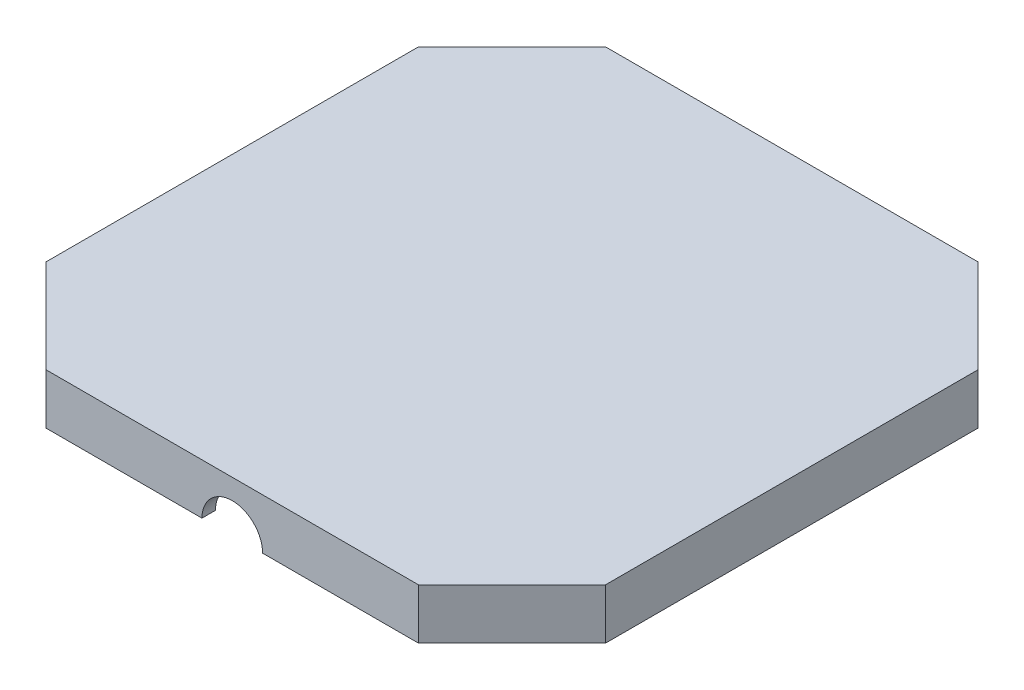
ISO-10303-21;
HEADER;
FILE_DESCRIPTION(('STEP AP214'),'2;1');
FILE_NAME('part.step','',(''),(''),'','','');
FILE_SCHEMA(('AUTOMOTIVE_DESIGN { 1 0 10303 214 1 1 1 1 }'));
ENDSEC;
DATA;
#1=APPLICATION_CONTEXT('core data for automotive mechanical design processes');
#2=APPLICATION_PROTOCOL_DEFINITION('international standard','automotive_design',2000,#1);
#3=PRODUCT_CONTEXT('',#1,'mechanical');
#4=PRODUCT('Part','Part','',(#3));
#5=PRODUCT_RELATED_PRODUCT_CATEGORY('part','',(#4));
#6=PRODUCT_DEFINITION_FORMATION('','',#4);
#7=PRODUCT_DEFINITION_CONTEXT('part definition',#1,'design');
#8=PRODUCT_DEFINITION('design','',#6,#7);
#9=PRODUCT_DEFINITION_SHAPE('','',#8);
#10=(LENGTH_UNIT() NAMED_UNIT(*) SI_UNIT(.MILLI.,.METRE.));
#11=(NAMED_UNIT(*) PLANE_ANGLE_UNIT() SI_UNIT($,.RADIAN.));
#12=(NAMED_UNIT(*) SI_UNIT($,.STERADIAN.) SOLID_ANGLE_UNIT());
#13=UNCERTAINTY_MEASURE_WITH_UNIT(LENGTH_MEASURE(1.E-05),#10,'distance_accuracy_value','');
#14=(GEOMETRIC_REPRESENTATION_CONTEXT(3) GLOBAL_UNCERTAINTY_ASSIGNED_CONTEXT((#13)) GLOBAL_UNIT_ASSIGNED_CONTEXT((#10,
#11,#12)) REPRESENTATION_CONTEXT('',''));
#15=CARTESIAN_POINT('',(0.,0.,0.));
#16=DIRECTION('',(0.,0.,1.));
#17=DIRECTION('',(1.,0.,0.));
#18=AXIS2_PLACEMENT_3D('',#15,#16,#17);
#19=CARTESIAN_POINT('',(-16.390525726858,13.,-48.8918002812121));
#20=DIRECTION('',(0.,0.,1.));
#21=DIRECTION('',(1.,0.,0.));
#22=AXIS2_PLACEMENT_3D('',#19,#20,#21);
#23=PLANE('',#22);
#24=DIRECTION('',(-1.,0.,0.));
#25=VECTOR('',#24,1.);
#26=CARTESIAN_POINT('',(-16.390525726858,7.5,-48.8918002812121));
#27=LINE('',#26,#25);
#28=CARTESIAN_POINT('',(38.0610471483957,7.5,-48.8918002812122));
#29=VERTEX_POINT('',#28);
#30=CARTESIAN_POINT('',(-15.5620986021118,7.5,-48.8918002812121));
#31=VERTEX_POINT('',#30);
#32=EDGE_CURVE('E11',#29,#31,#27,.T.);
#33=ORIENTED_EDGE('',*,*,#32,.F.);
#34=DIRECTION('',(0.,-1.,0.));
#35=VECTOR('',#34,1.);
#36=CARTESIAN_POINT('',(38.0610471483957,13.,-48.8918002812122));
#37=LINE('',#36,#35);
#38=CARTESIAN_POINT('',(38.0610471483957,13.,-48.8918002812122));
#39=VERTEX_POINT('',#38);
#40=EDGE_CURVE('E277',#39,#29,#37,.T.);
#41=ORIENTED_EDGE('',*,*,#40,.F.);
#42=DIRECTION('',(-1.,0.,0.));
#43=VECTOR('',#42,1.);
#44=CARTESIAN_POINT('',(-16.390525726858,13.,-48.8918002812121));
#45=LINE('',#44,#43);
#46=CARTESIAN_POINT('',(-15.5620986021118,13.,-48.8918002812121));
#47=VERTEX_POINT('',#46);
#48=EDGE_CURVE('E372',#39,#47,#45,.T.);
#49=ORIENTED_EDGE('',*,*,#48,.T.);
#50=DIRECTION('',(0.,-1.,0.));
#51=VECTOR('',#50,1.);
#52=CARTESIAN_POINT('',(-15.5620986021118,13.,-48.8918002812121));
#53=LINE('',#52,#51);
#54=EDGE_CURVE('E374',#47,#31,#53,.T.);
#55=ORIENTED_EDGE('',*,*,#54,.T.);
#56=EDGE_LOOP('',(#33,#41,#49,#55));
#57=FACE_BOUND('',#56,.T.);
#58=ADVANCED_FACE('F40',(#57),#23,.T.);
#59=CARTESIAN_POINT('',(-28.8356050757413,13.,-35.6182938075828));
#60=DIRECTION('',(0.707106781186544,0.,0.707106781186551));
#61=DIRECTION('',(0.707106781186551,0.,-0.707106781186544));
#62=AXIS2_PLACEMENT_3D('',#59,#60,#61);
#63=PLANE('',#62);
#64=DIRECTION('',(-0.707106781186551,0.,0.707106781186544));
#65=VECTOR('',#64,1.);
#66=CARTESIAN_POINT('',(-28.8356050757413,7.5,-35.6182938075828));
#67=LINE('',#66,#65);
#68=CARTESIAN_POINT('',(-28.2498186381144,7.5,-36.2040802452097));
#69=VERTEX_POINT('',#68);
#70=EDGE_CURVE('E407',#31,#69,#67,.T.);
#71=ORIENTED_EDGE('',*,*,#70,.F.);
#72=ORIENTED_EDGE('',*,*,#54,.F.);
#73=DIRECTION('',(-0.707106781186551,0.,0.707106781186544));
#74=VECTOR('',#73,1.);
#75=CARTESIAN_POINT('',(-28.8356050757413,13.,-35.6182938075828));
#76=LINE('',#75,#74);
#77=CARTESIAN_POINT('',(-28.2498186381144,13.,-36.2040802452097));
#78=VERTEX_POINT('',#77);
#79=EDGE_CURVE('E390',#47,#78,#76,.T.);
#80=ORIENTED_EDGE('',*,*,#79,.T.);
#81=DIRECTION('',(0.,-1.,0.));
#82=VECTOR('',#81,1.);
#83=CARTESIAN_POINT('',(-28.2498186381144,13.,-36.2040802452097));
#84=LINE('',#83,#82);
#85=EDGE_CURVE('E397',#78,#69,#84,.T.);
#86=ORIENTED_EDGE('',*,*,#85,.T.);
#87=EDGE_LOOP('',(#71,#72,#80,#86));
#88=FACE_BOUND('',#87,.T.);
#89=ADVANCED_FACE('F458',(#88),#63,.T.);
#90=CARTESIAN_POINT('',(13.96,7.5,0.));
#91=DIRECTION('',(0.,1.,0.));
#92=DIRECTION('',(0.,0.,1.));
#93=AXIS2_PLACEMENT_3D('',#90,#91,#92);
#94=PLANE('',#93);
#95=DIRECTION('',(0.,0.,1.));
#96=VECTOR('',#95,1.);
#97=CARTESIAN_POINT('',(-28.2498186381144,7.5,46.1674926300441));
#98=LINE('',#97,#96);
#99=CARTESIAN_POINT('',(-28.2498186381144,7.5,17.4190655052979));
#100=VERTEX_POINT('',#99);
#101=EDGE_CURVE('E49',#69,#100,#98,.T.);
#102=ORIENTED_EDGE('',*,*,#101,.T.);
#103=DIRECTION('',(0.707106781186546,0.,0.707106781186549));
#104=VECTOR('',#103,1.);
#105=CARTESIAN_POINT('',(-14.976312164485,7.5,30.6925719789274));
#106=LINE('',#105,#104);
#107=CARTESIAN_POINT('',(-15.5620986021119,7.5,30.1067855413005));
#108=VERTEX_POINT('',#107);
#109=EDGE_CURVE('E328',#100,#108,#106,.T.);
#110=ORIENTED_EDGE('',*,*,#109,.T.);
#111=DIRECTION('',(1.,0.,0.));
#112=VECTOR('',#111,1.);
#113=CARTESIAN_POINT('',(66.809474273142,7.5,30.1067855413005));
#114=LINE('',#113,#112);
#115=CARTESIAN_POINT('',(6.74947427314191,7.5,30.1067855413005));
#116=VERTEX_POINT('',#115);
#117=EDGE_CURVE('E326',#108,#116,#114,.T.);
#118=ORIENTED_EDGE('',*,*,#117,.T.);
#119=DIRECTION('',(0.,0.,1.));
#120=VECTOR('',#119,1.);
#121=CARTESIAN_POINT('',(6.74947427314191,7.5,22.1067855413005));
#122=LINE('',#121,#120);
#123=CARTESIAN_POINT('',(6.74947427314191,7.5,32.1067855413005));
#124=VERTEX_POINT('',#123);
#125=EDGE_CURVE('E308',#116,#124,#122,.T.);
#126=ORIENTED_EDGE('',*,*,#125,.T.);
#127=DIRECTION('',(1.,0.,0.));
#128=VECTOR('',#127,1.);
#129=CARTESIAN_POINT('',(66.809474273142,7.5,32.1067855413005));
#130=LINE('',#129,#128);
#131=CARTESIAN_POINT('',(-16.3905257268581,7.5,32.1067855413005));
#132=VERTEX_POINT('',#131);
#133=EDGE_CURVE('E329',#132,#124,#130,.T.);
#134=ORIENTED_EDGE('',*,*,#133,.F.);
#135=DIRECTION('',(0.707106781186546,0.,0.707106781186549));
#136=VECTOR('',#135,1.);
#137=CARTESIAN_POINT('',(-16.3905257268581,7.5,32.1067855413005));
#138=LINE('',#137,#136);
#139=CARTESIAN_POINT('',(-30.2498186381144,7.5,18.2474926300441));
#140=VERTEX_POINT('',#139);
#141=EDGE_CURVE('E331',#140,#132,#138,.T.);
#142=ORIENTED_EDGE('',*,*,#141,.F.);
#143=DIRECTION('',(0.,0.,1.));
#144=VECTOR('',#143,1.);
#145=CARTESIAN_POINT('',(-30.2498186381144,7.5,46.1674926300441));
#146=LINE('',#145,#144);
#147=CARTESIAN_POINT('',(-30.2498186381144,7.5,-37.0325073699559));
#148=VERTEX_POINT('',#147);
#149=EDGE_CURVE('E366',#148,#140,#146,.T.);
#150=ORIENTED_EDGE('',*,*,#149,.F.);
#151=DIRECTION('',(-0.707106781186551,0.,0.707106781186544));
#152=VECTOR('',#151,1.);
#153=CARTESIAN_POINT('',(-30.2498186381144,7.5,-37.0325073699559));
#154=LINE('',#153,#152);
#155=CARTESIAN_POINT('',(-16.390525726858,7.5,-50.8918002812121));
#156=VERTEX_POINT('',#155);
#157=EDGE_CURVE('E409',#156,#148,#154,.T.);
#158=ORIENTED_EDGE('',*,*,#157,.F.);
#159=DIRECTION('',(-1.,0.,0.));
#160=VECTOR('',#159,1.);
#161=CARTESIAN_POINT('',(-16.390525726858,7.5,-50.8918002812121));
#162=LINE('',#161,#160);
#163=CARTESIAN_POINT('',(38.8894742731419,7.5,-50.8918002812122));
#164=VERTEX_POINT('',#163);
#165=EDGE_CURVE('E364',#164,#156,#162,.T.);
#166=ORIENTED_EDGE('',*,*,#165,.F.);
#167=DIRECTION('',(-0.707106781186545,0.,-0.70710678118655));
#168=VECTOR('',#167,1.);
#169=CARTESIAN_POINT('',(52.7487671843983,7.5,-37.0325073699558));
#170=LINE('',#169,#168);
#171=CARTESIAN_POINT('',(52.7487671843983,7.5,-37.0325073699558));
#172=VERTEX_POINT('',#171);
#173=EDGE_CURVE('E293',#172,#164,#170,.T.);
#174=ORIENTED_EDGE('',*,*,#173,.F.);
#175=DIRECTION('',(0.,0.,-1.));
#176=VECTOR('',#175,1.);
#177=CARTESIAN_POINT('',(52.7487671843983,7.5,-37.0325073699558));
#178=LINE('',#177,#176);
#179=CARTESIAN_POINT('',(52.7487671843983,7.5,18.2474926300442));
#180=VERTEX_POINT('',#179);
#181=EDGE_CURVE('E300',#180,#172,#178,.T.);
#182=ORIENTED_EDGE('',*,*,#181,.F.);
#183=DIRECTION('',(0.707106781186549,0.,-0.707106781186546));
#184=VECTOR('',#183,1.);
#185=CARTESIAN_POINT('',(38.889474273142,7.5,32.1067855413005));
#186=LINE('',#185,#184);
#187=CARTESIAN_POINT('',(38.889474273142,7.5,32.1067855413005));
#188=VERTEX_POINT('',#187);
#189=EDGE_CURVE('E259',#188,#180,#186,.T.);
#190=ORIENTED_EDGE('',*,*,#189,.F.);
#191=DIRECTION('',(1.,0.,0.));
#192=VECTOR('',#191,1.);
#193=CARTESIAN_POINT('',(52.849474273142,7.5,32.1067855413005));
#194=LINE('',#193,#192);
#195=CARTESIAN_POINT('',(15.7494742731419,7.5,32.1067855413005));
#196=VERTEX_POINT('',#195);
#197=EDGE_CURVE('E306',#196,#188,#194,.T.);
#198=ORIENTED_EDGE('',*,*,#197,.F.);
#199=DIRECTION('',(0.,0.,1.));
#200=VECTOR('',#199,1.);
#201=CARTESIAN_POINT('',(15.7494742731419,7.5,22.1067855413005));
#202=LINE('',#201,#200);
#203=CARTESIAN_POINT('',(15.7494742731419,7.5,30.1067855413005));
#204=VERTEX_POINT('',#203);
#205=EDGE_CURVE('E312',#196,#204,#202,.F.);
#206=ORIENTED_EDGE('',*,*,#205,.T.);
#207=DIRECTION('',(1.,0.,0.));
#208=VECTOR('',#207,1.);
#209=CARTESIAN_POINT('',(52.849474273142,7.5,30.1067855413005));
#210=LINE('',#209,#208);
#211=CARTESIAN_POINT('',(38.0610471483958,7.5,30.1067855413005));
#212=VERTEX_POINT('',#211);
#213=EDGE_CURVE('E296',#204,#212,#210,.T.);
#214=ORIENTED_EDGE('',*,*,#213,.T.);
#215=DIRECTION('',(0.707106781186549,0.,-0.707106781186546));
#216=VECTOR('',#215,1.);
#217=CARTESIAN_POINT('',(37.4752607107689,7.5,30.6925719789274));
#218=LINE('',#217,#216);
#219=CARTESIAN_POINT('',(50.7487671843983,7.5,17.419065505298));
#220=VERTEX_POINT('',#219);
#221=EDGE_CURVE('E260',#212,#220,#218,.T.);
#222=ORIENTED_EDGE('',*,*,#221,.T.);
#223=DIRECTION('',(0.,0.,-1.));
#224=VECTOR('',#223,1.);
#225=CARTESIAN_POINT('',(50.7487671843983,7.5,-37.0325073699558));
#226=LINE('',#225,#224);
#227=CARTESIAN_POINT('',(50.7487671843983,7.5,-36.2040802452096));
#228=VERTEX_POINT('',#227);
#229=EDGE_CURVE('E297',#220,#228,#226,.T.);
#230=ORIENTED_EDGE('',*,*,#229,.T.);
#231=DIRECTION('',(-0.707106781186545,0.,-0.70710678118655));
#232=VECTOR('',#231,1.);
#233=CARTESIAN_POINT('',(51.3345536220252,7.5,-35.6182938075827));
#234=LINE('',#233,#232);
#235=EDGE_CURVE('E294',#228,#29,#234,.T.);
#236=ORIENTED_EDGE('',*,*,#235,.T.);
#237=ORIENTED_EDGE('',*,*,#32,.T.);
#238=ORIENTED_EDGE('',*,*,#70,.T.);
#239=EDGE_LOOP('',(#102,#110,#118,#126,#134,#142,#150,#158,#166,#174,#182,#190,#198,#206,#214,
#222,#230,#236,#237,#238));
#240=FACE_BOUND('',#239,.T.);
#241=ADVANCED_FACE('F464',(#240),#94,.F.);
#242=CARTESIAN_POINT('',(-30.2498186381144,15.,-37.0325073699559));
#243=DIRECTION('',(0.707106781186544,0.,0.707106781186551));
#244=DIRECTION('',(0.707106781186551,0.,-0.707106781186544));
#245=AXIS2_PLACEMENT_3D('',#242,#243,#244);
#246=PLANE('',#245);
#247=DIRECTION('',(0.,-1.,0.));
#248=VECTOR('',#247,1.);
#249=CARTESIAN_POINT('',(-16.390525726858,15.,-50.8918002812121));
#250=LINE('',#249,#248);
#251=CARTESIAN_POINT('',(-16.390525726858,15.,-50.8918002812121));
#252=VERTEX_POINT('',#251);
#253=EDGE_CURVE('E370',#252,#156,#250,.T.);
#254=ORIENTED_EDGE('',*,*,#253,.T.);
#255=ORIENTED_EDGE('',*,*,#157,.T.);
#256=DIRECTION('',(0.,-1.,0.));
#257=VECTOR('',#256,1.);
#258=CARTESIAN_POINT('',(-30.2498186381144,15.,-37.0325073699559));
#259=LINE('',#258,#257);
#260=CARTESIAN_POINT('',(-30.2498186381144,15.,-37.0325073699559));
#261=VERTEX_POINT('',#260);
#262=EDGE_CURVE('E367',#261,#148,#259,.T.);
#263=ORIENTED_EDGE('',*,*,#262,.F.);
#264=DIRECTION('',(-0.707106781186551,0.,0.707106781186544));
#265=VECTOR('',#264,1.);
#266=CARTESIAN_POINT('',(-30.2498186381144,15.,-37.0325073699559));
#267=LINE('',#266,#265);
#268=EDGE_CURVE('E400',#252,#261,#267,.T.);
#269=ORIENTED_EDGE('',*,*,#268,.F.);
#270=EDGE_LOOP('',(#254,#255,#263,#269));
#271=FACE_BOUND('',#270,.T.);
#272=ADVANCED_FACE('F474',(#271),#246,.F.);
#273=CARTESIAN_POINT('',(-16.390525726858,15.,-50.8918002812121));
#274=DIRECTION('',(0.,0.,1.));
#275=DIRECTION('',(1.,0.,0.));
#276=AXIS2_PLACEMENT_3D('',#273,#274,#275);
#277=PLANE('',#276);
#278=DIRECTION('',(-1.,0.,0.));
#279=VECTOR('',#278,1.);
#280=CARTESIAN_POINT('',(-16.390525726858,15.,-50.8918002812121));
#281=LINE('',#280,#279);
#282=CARTESIAN_POINT('',(38.8894742731419,15.,-50.8918002812122));
#283=VERTEX_POINT('',#282);
#284=EDGE_CURVE('E368',#283,#252,#281,.T.);
#285=ORIENTED_EDGE('',*,*,#284,.F.);
#286=DIRECTION('',(0.,-1.,0.));
#287=VECTOR('',#286,1.);
#288=CARTESIAN_POINT('',(38.8894742731419,15.,-50.8918002812122));
#289=LINE('',#288,#287);
#290=EDGE_CURVE('E287',#283,#164,#289,.T.);
#291=ORIENTED_EDGE('',*,*,#290,.T.);
#292=ORIENTED_EDGE('',*,*,#165,.T.);
#293=ORIENTED_EDGE('',*,*,#253,.F.);
#294=EDGE_LOOP('',(#285,#291,#292,#293));
#295=FACE_BOUND('',#294,.T.);
#296=ADVANCED_FACE('F471',(#295),#277,.F.);
#297=CARTESIAN_POINT('',(13.96,13.,0.));
#298=DIRECTION('',(0.,1.,0.));
#299=DIRECTION('',(0.,0.,1.));
#300=AXIS2_PLACEMENT_3D('',#297,#298,#299);
#301=PLANE('',#300);
#302=DIRECTION('',(0.707106781186549,0.,-0.707106781186546));
#303=VECTOR('',#302,1.);
#304=CARTESIAN_POINT('',(37.4752607107689,13.,30.6925719789274));
#305=LINE('',#304,#303);
#306=CARTESIAN_POINT('',(38.0610471483958,13.,30.1067855413005));
#307=VERTEX_POINT('',#306);
#308=CARTESIAN_POINT('',(50.7487671843983,13.,17.419065505298));
#309=VERTEX_POINT('',#308);
#310=EDGE_CURVE('E240',#307,#309,#305,.T.);
#311=ORIENTED_EDGE('',*,*,#310,.F.);
#312=DIRECTION('',(1.,0.,0.));
#313=VECTOR('',#312,1.);
#314=CARTESIAN_POINT('',(66.809474273142,13.,30.1067855413005));
#315=LINE('',#314,#313);
#316=CARTESIAN_POINT('',(-15.5620986021119,13.,30.1067855413005));
#317=VERTEX_POINT('',#316);
#318=EDGE_CURVE('E337',#317,#307,#315,.T.);
#319=ORIENTED_EDGE('',*,*,#318,.F.);
#320=DIRECTION('',(0.707106781186546,0.,0.707106781186549));
#321=VECTOR('',#320,1.);
#322=CARTESIAN_POINT('',(-14.976312164485,13.,30.6925719789274));
#323=LINE('',#322,#321);
#324=CARTESIAN_POINT('',(-28.2498186381144,13.,17.4190655052979));
#325=VERTEX_POINT('',#324);
#326=EDGE_CURVE('E340',#325,#317,#323,.T.);
#327=ORIENTED_EDGE('',*,*,#326,.F.);
#328=DIRECTION('',(0.,0.,1.));
#329=VECTOR('',#328,1.);
#330=CARTESIAN_POINT('',(-28.2498186381144,13.,46.1674926300441));
#331=LINE('',#330,#329);
#332=EDGE_CURVE('E375',#78,#325,#331,.T.);
#333=ORIENTED_EDGE('',*,*,#332,.F.);
#334=ORIENTED_EDGE('',*,*,#79,.F.);
#335=ORIENTED_EDGE('',*,*,#48,.F.);
#336=DIRECTION('',(-0.707106781186545,0.,-0.70710678118655));
#337=VECTOR('',#336,1.);
#338=CARTESIAN_POINT('',(51.3345536220252,13.,-35.6182938075827));
#339=LINE('',#338,#337);
#340=CARTESIAN_POINT('',(50.7487671843983,13.,-36.2040802452096));
#341=VERTEX_POINT('',#340);
#342=EDGE_CURVE('E274',#341,#39,#339,.T.);
#343=ORIENTED_EDGE('',*,*,#342,.F.);
#344=DIRECTION('',(0.,0.,-1.));
#345=VECTOR('',#344,1.);
#346=CARTESIAN_POINT('',(50.7487671843983,13.,-37.0325073699558));
#347=LINE('',#346,#345);
#348=EDGE_CURVE('E271',#309,#341,#347,.T.);
#349=ORIENTED_EDGE('',*,*,#348,.F.);
#350=EDGE_LOOP('',(#311,#319,#327,#333,#334,#335,#343,#349));
#351=FACE_BOUND('',#350,.T.);
#352=DIRECTION('',(0.,0.,-1.));
#353=VECTOR('',#352,1.);
#354=CARTESIAN_POINT('',(-16.2498186381144,13.,40.3685027568208));
#355=LINE('',#354,#353);
#356=CARTESIAN_POINT('',(-16.2498186381144,13.,12.4485027568208));
#357=VERTEX_POINT('',#356);
#358=CARTESIAN_POINT('',(-16.2498186381144,13.,-31.2335174967325));
#359=VERTEX_POINT('',#358);
#360=EDGE_CURVE('E44',#357,#359,#355,.T.);
#361=ORIENTED_EDGE('',*,*,#360,.F.);
#362=DIRECTION('',(-0.707106781186546,0.,-0.707106781186549));
#363=VECTOR('',#362,1.);
#364=CARTESIAN_POINT('',(-10.5915358536348,13.,18.1067855413005));
#365=LINE('',#364,#363);
#366=CARTESIAN_POINT('',(-10.5915358536348,13.,18.1067855413005));
#367=VERTEX_POINT('',#366);
#368=EDGE_CURVE('E324',#367,#357,#365,.T.);
#369=ORIENTED_EDGE('',*,*,#368,.F.);
#370=DIRECTION('',(-1.,0.,0.));
#371=VECTOR('',#370,1.);
#372=CARTESIAN_POINT('',(61.0104843999187,13.,18.1067855413005));
#373=LINE('',#372,#371);
#374=CARTESIAN_POINT('',(33.0904843999187,13.,18.1067855413005));
#375=VERTEX_POINT('',#374);
#376=EDGE_CURVE('E320',#375,#367,#373,.T.);
#377=ORIENTED_EDGE('',*,*,#376,.F.);
#378=DIRECTION('',(-0.707106781186549,0.,0.707106781186546));
#379=VECTOR('',#378,1.);
#380=CARTESIAN_POINT('',(38.7487671843983,13.,12.4485027568209));
#381=LINE('',#380,#379);
#382=CARTESIAN_POINT('',(38.7487671843983,13.,12.4485027568209));
#383=VERTEX_POINT('',#382);
#384=EDGE_CURVE('E236',#383,#375,#381,.T.);
#385=ORIENTED_EDGE('',*,*,#384,.F.);
#386=DIRECTION('',(0.,0.,1.));
#387=VECTOR('',#386,1.);
#388=CARTESIAN_POINT('',(38.7487671843983,13.,-31.2335174967325));
#389=LINE('',#388,#387);
#390=CARTESIAN_POINT('',(38.7487671843983,13.,-31.2335174967325));
#391=VERTEX_POINT('',#390);
#392=EDGE_CURVE('E227',#391,#383,#389,.T.);
#393=ORIENTED_EDGE('',*,*,#392,.F.);
#394=DIRECTION('',(0.707106781186546,0.,0.707106781186549));
#395=VECTOR('',#394,1.);
#396=CARTESIAN_POINT('',(33.0904843999186,13.,-36.8918002812122));
#397=LINE('',#396,#395);
#398=CARTESIAN_POINT('',(33.0904843999186,13.,-36.8918002812122));
#399=VERTEX_POINT('',#398);
#400=EDGE_CURVE('E263',#399,#391,#397,.T.);
#401=ORIENTED_EDGE('',*,*,#400,.F.);
#402=DIRECTION('',(1.,0.,0.));
#403=VECTOR('',#402,1.);
#404=CARTESIAN_POINT('',(-10.5915358536347,13.,-36.8918002812121));
#405=LINE('',#404,#403);
#406=CARTESIAN_POINT('',(-10.5915358536347,13.,-36.8918002812121));
#407=VERTEX_POINT('',#406);
#408=EDGE_CURVE('E380',#407,#399,#405,.T.);
#409=ORIENTED_EDGE('',*,*,#408,.F.);
#410=DIRECTION('',(0.707106781186551,0.,-0.707106781186544));
#411=VECTOR('',#410,1.);
#412=CARTESIAN_POINT('',(-16.2498186381144,13.,-31.2335174967325));
#413=LINE('',#412,#411);
#414=EDGE_CURVE('E383',#359,#407,#413,.T.);
#415=ORIENTED_EDGE('',*,*,#414,.F.);
#416=EDGE_LOOP('',(#361,#369,#377,#385,#393,#401,#409,#415));
#417=FACE_BOUND('',#416,.T.);
#418=ADVANCED_FACE('F432',(#351,#417),#301,.F.);
#419=CARTESIAN_POINT('',(-10.5915358536347,14.,-36.8918002812121));
#420=DIRECTION('',(0.,0.,-1.));
#421=DIRECTION('',(-1.,0.,0.));
#422=AXIS2_PLACEMENT_3D('',#419,#420,#421);
#423=PLANE('',#422);
#424=ORIENTED_EDGE('',*,*,#408,.T.);
#425=DIRECTION('',(0.,-1.,0.));
#426=VECTOR('',#425,1.);
#427=CARTESIAN_POINT('',(33.0904843999186,14.,-36.8918002812122));
#428=LINE('',#427,#426);
#429=CARTESIAN_POINT('',(33.0904843999186,14.,-36.8918002812122));
#430=VERTEX_POINT('',#429);
#431=EDGE_CURVE('E221',#430,#399,#428,.T.);
#432=ORIENTED_EDGE('',*,*,#431,.F.);
#433=DIRECTION('',(1.,0.,0.));
#434=VECTOR('',#433,1.);
#435=CARTESIAN_POINT('',(-10.5915358536347,14.,-36.8918002812121));
#436=LINE('',#435,#434);
#437=CARTESIAN_POINT('',(-10.5915358536347,14.,-36.8918002812121));
#438=VERTEX_POINT('',#437);
#439=EDGE_CURVE('E376',#438,#430,#436,.T.);
#440=ORIENTED_EDGE('',*,*,#439,.F.);
#441=DIRECTION('',(0.,-1.,0.));
#442=VECTOR('',#441,1.);
#443=CARTESIAN_POINT('',(-10.5915358536347,14.,-36.8918002812121));
#444=LINE('',#443,#442);
#445=EDGE_CURVE('E388',#438,#407,#444,.T.);
#446=ORIENTED_EDGE('',*,*,#445,.T.);
#447=EDGE_LOOP('',(#424,#432,#440,#446));
#448=FACE_BOUND('',#447,.T.);
#449=ADVANCED_FACE('F427',(#448),#423,.F.);
#450=CARTESIAN_POINT('',(-16.2498186381144,14.,-31.2335174967325));
#451=DIRECTION('',(-0.707106781186544,0.,-0.707106781186551));
#452=DIRECTION('',(-0.707106781186551,0.,0.707106781186544));
#453=AXIS2_PLACEMENT_3D('',#450,#451,#452);
#454=PLANE('',#453);
#455=ORIENTED_EDGE('',*,*,#414,.T.);
#456=ORIENTED_EDGE('',*,*,#445,.F.);
#457=DIRECTION('',(0.707106781186551,0.,-0.707106781186544));
#458=VECTOR('',#457,1.);
#459=CARTESIAN_POINT('',(-16.2498186381144,14.,-31.2335174967325));
#460=LINE('',#459,#458);
#461=CARTESIAN_POINT('',(-16.2498186381144,14.,-31.2335174967325));
#462=VERTEX_POINT('',#461);
#463=EDGE_CURVE('E379',#462,#438,#460,.T.);
#464=ORIENTED_EDGE('',*,*,#463,.F.);
#465=DIRECTION('',(0.,-1.,0.));
#466=VECTOR('',#465,1.);
#467=CARTESIAN_POINT('',(-16.2498186381144,14.,-31.2335174967325));
#468=LINE('',#467,#466);
#469=EDGE_CURVE('E378',#462,#359,#468,.T.);
#470=ORIENTED_EDGE('',*,*,#469,.T.);
#471=EDGE_LOOP('',(#455,#456,#464,#470));
#472=FACE_BOUND('',#471,.T.);
#473=ADVANCED_FACE('F422',(#472),#454,.F.);
#474=CARTESIAN_POINT('',(-16.2498186381144,14.,40.3685027568208));
#475=DIRECTION('',(-1.,0.,0.));
#476=DIRECTION('',(0.,0.,1.));
#477=AXIS2_PLACEMENT_3D('',#474,#475,#476);
#478=PLANE('',#477);
#479=DIRECTION('',(0.,0.,-1.));
#480=VECTOR('',#479,1.);
#481=CARTESIAN_POINT('',(-16.2498186381144,14.,40.3685027568208));
#482=LINE('',#481,#480);
#483=CARTESIAN_POINT('',(-16.2498186381144,14.,12.4485027568208));
#484=VERTEX_POINT('',#483);
#485=EDGE_CURVE('E382',#484,#462,#482,.T.);
#486=ORIENTED_EDGE('',*,*,#485,.F.);
#487=DIRECTION('',(0.,-1.,0.));
#488=VECTOR('',#487,1.);
#489=CARTESIAN_POINT('',(-16.2498186381144,14.,12.4485027568208));
#490=LINE('',#489,#488);
#491=EDGE_CURVE('E346',#484,#357,#490,.T.);
#492=ORIENTED_EDGE('',*,*,#491,.T.);
#493=ORIENTED_EDGE('',*,*,#360,.T.);
#494=ORIENTED_EDGE('',*,*,#469,.F.);
#495=EDGE_LOOP('',(#486,#492,#493,#494));
#496=FACE_BOUND('',#495,.T.);
#497=ADVANCED_FACE('F419',(#496),#478,.F.);
#498=CARTESIAN_POINT('',(13.96,14.,0.));
#499=DIRECTION('',(0.,-1.,0.));
#500=DIRECTION('',(0.,0.,-1.));
#501=AXIS2_PLACEMENT_3D('',#498,#499,#500);
#502=PLANE('',#501);
#503=ORIENTED_EDGE('',*,*,#439,.T.);
#504=DIRECTION('',(0.707106781186546,0.,0.707106781186549));
#505=VECTOR('',#504,1.);
#506=CARTESIAN_POINT('',(33.0904843999186,14.,-36.8918002812122));
#507=LINE('',#506,#505);
#508=CARTESIAN_POINT('',(38.7487671843983,14.,-31.2335174967325));
#509=VERTEX_POINT('',#508);
#510=EDGE_CURVE('E219',#430,#509,#507,.T.);
#511=ORIENTED_EDGE('',*,*,#510,.T.);
#512=DIRECTION('',(0.,0.,1.));
#513=VECTOR('',#512,1.);
#514=CARTESIAN_POINT('',(38.7487671843983,14.,-31.2335174967325));
#515=LINE('',#514,#513);
#516=CARTESIAN_POINT('',(38.7487671843983,14.,12.4485027568209));
#517=VERTEX_POINT('',#516);
#518=EDGE_CURVE('E214',#509,#517,#515,.T.);
#519=ORIENTED_EDGE('',*,*,#518,.T.);
#520=DIRECTION('',(-0.707106781186549,0.,0.707106781186546));
#521=VECTOR('',#520,1.);
#522=CARTESIAN_POINT('',(38.7487671843983,14.,12.4485027568209));
#523=LINE('',#522,#521);
#524=CARTESIAN_POINT('',(33.0904843999187,14.,18.1067855413005));
#525=VERTEX_POINT('',#524);
#526=EDGE_CURVE('E217',#517,#525,#523,.T.);
#527=ORIENTED_EDGE('',*,*,#526,.T.);
#528=DIRECTION('',(-1.,0.,0.));
#529=VECTOR('',#528,1.);
#530=CARTESIAN_POINT('',(61.0104843999187,14.,18.1067855413005));
#531=LINE('',#530,#529);
#532=CARTESIAN_POINT('',(-10.5915358536348,14.,18.1067855413005));
#533=VERTEX_POINT('',#532);
#534=EDGE_CURVE('E321',#525,#533,#531,.T.);
#535=ORIENTED_EDGE('',*,*,#534,.T.);
#536=DIRECTION('',(-0.707106781186546,0.,-0.707106781186549));
#537=VECTOR('',#536,1.);
#538=CARTESIAN_POINT('',(-10.5915358536348,14.,18.1067855413005));
#539=LINE('',#538,#537);
#540=EDGE_CURVE('E323',#533,#484,#539,.T.);
#541=ORIENTED_EDGE('',*,*,#540,.T.);
#542=ORIENTED_EDGE('',*,*,#485,.T.);
#543=ORIENTED_EDGE('',*,*,#463,.T.);
#544=EDGE_LOOP('',(#503,#511,#519,#527,#535,#541,#542,#543));
#545=FACE_BOUND('',#544,.T.);
#546=ADVANCED_FACE('F42',(#545),#502,.T.);
#547=CARTESIAN_POINT('',(-30.2498186381144,15.,46.1674926300441));
#548=DIRECTION('',(1.,0.,0.));
#549=DIRECTION('',(0.,0.,-1.));
#550=AXIS2_PLACEMENT_3D('',#547,#548,#549);
#551=PLANE('',#550);
#552=ORIENTED_EDGE('',*,*,#149,.T.);
#553=DIRECTION('',(0.,-1.,0.));
#554=VECTOR('',#553,1.);
#555=CARTESIAN_POINT('',(-30.2498186381144,15.,18.2474926300441));
#556=LINE('',#555,#554);
#557=CARTESIAN_POINT('',(-30.2498186381144,15.,18.2474926300441));
#558=VERTEX_POINT('',#557);
#559=EDGE_CURVE('E332',#558,#140,#556,.T.);
#560=ORIENTED_EDGE('',*,*,#559,.F.);
#561=DIRECTION('',(0.,0.,1.));
#562=VECTOR('',#561,1.);
#563=CARTESIAN_POINT('',(-30.2498186381144,15.,46.1674926300441));
#564=LINE('',#563,#562);
#565=EDGE_CURVE('E371',#261,#558,#564,.T.);
#566=ORIENTED_EDGE('',*,*,#565,.F.);
#567=ORIENTED_EDGE('',*,*,#262,.T.);
#568=EDGE_LOOP('',(#552,#560,#566,#567));
#569=FACE_BOUND('',#568,.T.);
#570=ADVANCED_FACE('F489',(#569),#551,.F.);
#571=CARTESIAN_POINT('',(13.96,15.,0.));
#572=DIRECTION('',(0.,1.,0.));
#573=DIRECTION('',(0.,0.,1.));
#574=AXIS2_PLACEMENT_3D('',#571,#572,#573);
#575=PLANE('',#574);
#576=ORIENTED_EDGE('',*,*,#565,.T.);
#577=DIRECTION('',(0.707106781186546,0.,0.707106781186549));
#578=VECTOR('',#577,1.);
#579=CARTESIAN_POINT('',(-16.3905257268581,15.,32.1067855413005));
#580=LINE('',#579,#578);
#581=CARTESIAN_POINT('',(-16.3905257268581,15.,32.1067855413005));
#582=VERTEX_POINT('',#581);
#583=EDGE_CURVE('E336',#558,#582,#580,.T.);
#584=ORIENTED_EDGE('',*,*,#583,.T.);
#585=DIRECTION('',(1.,0.,0.));
#586=VECTOR('',#585,1.);
#587=CARTESIAN_POINT('',(66.809474273142,15.,32.1067855413005));
#588=LINE('',#587,#586);
#589=CARTESIAN_POINT('',(38.889474273142,15.,32.1067855413005));
#590=VERTEX_POINT('',#589);
#591=EDGE_CURVE('E333',#582,#590,#588,.T.);
#592=ORIENTED_EDGE('',*,*,#591,.T.);
#593=DIRECTION('',(0.707106781186549,0.,-0.707106781186546));
#594=VECTOR('',#593,1.);
#595=CARTESIAN_POINT('',(38.889474273142,15.,32.1067855413005));
#596=LINE('',#595,#594);
#597=CARTESIAN_POINT('',(52.7487671843983,15.,18.2474926300442));
#598=VERTEX_POINT('',#597);
#599=EDGE_CURVE('E250',#590,#598,#596,.T.);
#600=ORIENTED_EDGE('',*,*,#599,.T.);
#601=DIRECTION('',(0.,0.,-1.));
#602=VECTOR('',#601,1.);
#603=CARTESIAN_POINT('',(52.7487671843983,15.,-37.0325073699558));
#604=LINE('',#603,#602);
#605=CARTESIAN_POINT('',(52.7487671843983,15.,-37.0325073699558));
#606=VERTEX_POINT('',#605);
#607=EDGE_CURVE('E283',#598,#606,#604,.T.);
#608=ORIENTED_EDGE('',*,*,#607,.T.);
#609=DIRECTION('',(-0.707106781186545,0.,-0.70710678118655));
#610=VECTOR('',#609,1.);
#611=CARTESIAN_POINT('',(52.7487671843983,15.,-37.0325073699558));
#612=LINE('',#611,#610);
#613=EDGE_CURVE('E284',#606,#283,#612,.T.);
#614=ORIENTED_EDGE('',*,*,#613,.T.);
#615=ORIENTED_EDGE('',*,*,#284,.T.);
#616=ORIENTED_EDGE('',*,*,#268,.T.);
#617=EDGE_LOOP('',(#576,#584,#592,#600,#608,#614,#615,#616));
#618=FACE_BOUND('',#617,.T.);
#619=ADVANCED_FACE('F488',(#618),#575,.T.);
#620=CARTESIAN_POINT('',(-28.2498186381144,13.,46.1674926300441));
#621=DIRECTION('',(1.,0.,0.));
#622=DIRECTION('',(0.,0.,-1.));
#623=AXIS2_PLACEMENT_3D('',#620,#621,#622);
#624=PLANE('',#623);
#625=ORIENTED_EDGE('',*,*,#332,.T.);
#626=DIRECTION('',(0.,-1.,0.));
#627=VECTOR('',#626,1.);
#628=CARTESIAN_POINT('',(-28.2498186381144,13.,17.4190655052979));
#629=LINE('',#628,#627);
#630=EDGE_CURVE('E354',#325,#100,#629,.T.);
#631=ORIENTED_EDGE('',*,*,#630,.T.);
#632=ORIENTED_EDGE('',*,*,#101,.F.);
#633=ORIENTED_EDGE('',*,*,#85,.F.);
#634=EDGE_LOOP('',(#625,#631,#632,#633));
#635=FACE_BOUND('',#634,.T.);
#636=ADVANCED_FACE('F452',(#635),#624,.T.);
#637=CARTESIAN_POINT('',(-14.976312164485,13.,30.6925719789274));
#638=DIRECTION('',(0.707106781186549,0.,-0.707106781186546));
#639=DIRECTION('',(-0.707106781186546,0.,-0.707106781186549));
#640=AXIS2_PLACEMENT_3D('',#637,#638,#639);
#641=PLANE('',#640);
#642=ORIENTED_EDGE('',*,*,#109,.F.);
#643=ORIENTED_EDGE('',*,*,#630,.F.);
#644=ORIENTED_EDGE('',*,*,#326,.T.);
#645=DIRECTION('',(0.,-1.,0.));
#646=VECTOR('',#645,1.);
#647=CARTESIAN_POINT('',(-15.5620986021119,13.,30.1067855413005));
#648=LINE('',#647,#646);
#649=EDGE_CURVE('E339',#317,#108,#648,.T.);
#650=ORIENTED_EDGE('',*,*,#649,.T.);
#651=EDGE_LOOP('',(#642,#643,#644,#650));
#652=FACE_BOUND('',#651,.T.);
#653=ADVANCED_FACE('F442',(#652),#641,.T.);
#654=CARTESIAN_POINT('',(66.809474273142,13.,30.1067855413005));
#655=DIRECTION('',(0.,0.,-1.));
#656=DIRECTION('',(-1.,0.,0.));
#657=AXIS2_PLACEMENT_3D('',#654,#655,#656);
#658=PLANE('',#657);
#659=ORIENTED_EDGE('',*,*,#318,.T.);
#660=DIRECTION('',(0.,-1.,0.));
#661=VECTOR('',#660,1.);
#662=CARTESIAN_POINT('',(38.0610471483958,13.,30.1067855413005));
#663=LINE('',#662,#661);
#664=EDGE_CURVE('E247',#307,#212,#663,.T.);
#665=ORIENTED_EDGE('',*,*,#664,.T.);
#666=ORIENTED_EDGE('',*,*,#213,.F.);
#667=CARTESIAN_POINT('',(11.2494742731419,7.5,30.1067855413005));
#668=DIRECTION('',(0.,0.,-1.));
#669=DIRECTION('',(-1.,0.,0.));
#670=AXIS2_PLACEMENT_3D('',#667,#668,#669);
#671=CIRCLE('',#670,4.5);
#672=EDGE_CURVE('E315',#116,#204,#671,.T.);
#673=ORIENTED_EDGE('',*,*,#672,.F.);
#674=ORIENTED_EDGE('',*,*,#117,.F.);
#675=ORIENTED_EDGE('',*,*,#649,.F.);
#676=EDGE_LOOP('',(#659,#665,#666,#673,#674,#675));
#677=FACE_BOUND('',#676,.T.);
#678=ADVANCED_FACE('F455',(#677),#658,.T.);
#679=CARTESIAN_POINT('',(-16.3905257268581,15.,32.1067855413005));
#680=DIRECTION('',(0.707106781186549,0.,-0.707106781186546));
#681=DIRECTION('',(-0.707106781186546,0.,-0.707106781186549));
#682=AXIS2_PLACEMENT_3D('',#679,#680,#681);
#683=PLANE('',#682);
#684=ORIENTED_EDGE('',*,*,#559,.T.);
#685=ORIENTED_EDGE('',*,*,#141,.T.);
#686=DIRECTION('',(0.,-1.,0.));
#687=VECTOR('',#686,1.);
#688=CARTESIAN_POINT('',(-16.3905257268581,15.,32.1067855413005));
#689=LINE('',#688,#687);
#690=EDGE_CURVE('E335',#582,#132,#689,.T.);
#691=ORIENTED_EDGE('',*,*,#690,.F.);
#692=ORIENTED_EDGE('',*,*,#583,.F.);
#693=EDGE_LOOP('',(#684,#685,#691,#692));
#694=FACE_BOUND('',#693,.T.);
#695=ADVANCED_FACE('F449',(#694),#683,.F.);
#696=CARTESIAN_POINT('',(66.809474273142,15.,32.1067855413005));
#697=DIRECTION('',(0.,0.,-1.));
#698=DIRECTION('',(-1.,0.,0.));
#699=AXIS2_PLACEMENT_3D('',#696,#697,#698);
#700=PLANE('',#699);
#701=ORIENTED_EDGE('',*,*,#133,.T.);
#702=CARTESIAN_POINT('',(11.2494742731419,7.5,32.1067855413005));
#703=DIRECTION('',(0.,0.,1.));
#704=DIRECTION('',(1.,0.,0.));
#705=AXIS2_PLACEMENT_3D('',#702,#703,#704);
#706=CIRCLE('',#705,4.5);
#707=EDGE_CURVE('E317',#196,#124,#706,.T.);
#708=ORIENTED_EDGE('',*,*,#707,.F.);
#709=ORIENTED_EDGE('',*,*,#197,.T.);
#710=DIRECTION('',(0.,-1.,0.));
#711=VECTOR('',#710,1.);
#712=CARTESIAN_POINT('',(38.889474273142,15.,32.1067855413005));
#713=LINE('',#712,#711);
#714=EDGE_CURVE('E256',#590,#188,#713,.T.);
#715=ORIENTED_EDGE('',*,*,#714,.F.);
#716=ORIENTED_EDGE('',*,*,#591,.F.);
#717=ORIENTED_EDGE('',*,*,#690,.T.);
#718=EDGE_LOOP('',(#701,#708,#709,#715,#716,#717));
#719=FACE_BOUND('',#718,.T.);
#720=ADVANCED_FACE('F440',(#719),#700,.F.);
#721=CARTESIAN_POINT('',(-10.5915358536348,14.,18.1067855413005));
#722=DIRECTION('',(-0.707106781186549,0.,0.707106781186546));
#723=DIRECTION('',(0.707106781186546,0.,0.707106781186549));
#724=AXIS2_PLACEMENT_3D('',#721,#722,#723);
#725=PLANE('',#724);
#726=ORIENTED_EDGE('',*,*,#368,.T.);
#727=ORIENTED_EDGE('',*,*,#491,.F.);
#728=ORIENTED_EDGE('',*,*,#540,.F.);
#729=DIRECTION('',(0.,-1.,0.));
#730=VECTOR('',#729,1.);
#731=CARTESIAN_POINT('',(-10.5915358536348,14.,18.1067855413005));
#732=LINE('',#731,#730);
#733=EDGE_CURVE('E343',#533,#367,#732,.T.);
#734=ORIENTED_EDGE('',*,*,#733,.T.);
#735=EDGE_LOOP('',(#726,#727,#728,#734));
#736=FACE_BOUND('',#735,.T.);
#737=ADVANCED_FACE('F438',(#736),#725,.F.);
#738=CARTESIAN_POINT('',(61.0104843999187,14.,18.1067855413005));
#739=DIRECTION('',(0.,0.,1.));
#740=DIRECTION('',(1.,0.,0.));
#741=AXIS2_PLACEMENT_3D('',#738,#739,#740);
#742=PLANE('',#741);
#743=ORIENTED_EDGE('',*,*,#534,.F.);
#744=DIRECTION('',(0.,-1.,0.));
#745=VECTOR('',#744,1.);
#746=CARTESIAN_POINT('',(33.0904843999187,14.,18.1067855413005));
#747=LINE('',#746,#745);
#748=EDGE_CURVE('E231',#525,#375,#747,.T.);
#749=ORIENTED_EDGE('',*,*,#748,.T.);
#750=ORIENTED_EDGE('',*,*,#376,.T.);
#751=ORIENTED_EDGE('',*,*,#733,.F.);
#752=EDGE_LOOP('',(#743,#749,#750,#751));
#753=FACE_BOUND('',#752,.T.);
#754=ADVANCED_FACE('F436',(#753),#742,.F.);
#755=CARTESIAN_POINT('',(11.2494742731419,7.5,22.1067855413005));
#756=DIRECTION('',(0.,0.,1.));
#757=DIRECTION('',(1.,0.,0.));
#758=AXIS2_PLACEMENT_3D('',#755,#756,#757);
#759=CYLINDRICAL_SURFACE('',#758,4.5);
#760=ORIENTED_EDGE('',*,*,#672,.T.);
#761=ORIENTED_EDGE('',*,*,#205,.F.);
#762=ORIENTED_EDGE('',*,*,#707,.T.);
#763=ORIENTED_EDGE('',*,*,#125,.F.);
#764=EDGE_LOOP('',(#760,#761,#762,#763));
#765=FACE_BOUND('',#764,.T.);
#766=ADVANCED_FACE('F447',(#765),#759,.F.);
#767=CARTESIAN_POINT('',(52.7487671843983,15.,-37.0325073699558));
#768=DIRECTION('',(-0.70710678118655,0.,0.707106781186545));
#769=DIRECTION('',(0.707106781186545,0.,0.70710678118655));
#770=AXIS2_PLACEMENT_3D('',#767,#768,#769);
#771=PLANE('',#770);
#772=DIRECTION('',(0.,-1.,0.));
#773=VECTOR('',#772,1.);
#774=CARTESIAN_POINT('',(52.7487671843983,15.,-37.0325073699558));
#775=LINE('',#774,#773);
#776=EDGE_CURVE('E290',#606,#172,#775,.T.);
#777=ORIENTED_EDGE('',*,*,#776,.T.);
#778=ORIENTED_EDGE('',*,*,#173,.T.);
#779=ORIENTED_EDGE('',*,*,#290,.F.);
#780=ORIENTED_EDGE('',*,*,#613,.F.);
#781=EDGE_LOOP('',(#777,#778,#779,#780));
#782=FACE_BOUND('',#781,.T.);
#783=ADVANCED_FACE('F565',(#782),#771,.F.);
#784=CARTESIAN_POINT('',(52.7487671843983,15.,-37.0325073699558));
#785=DIRECTION('',(-1.,0.,0.));
#786=DIRECTION('',(0.,0.,1.));
#787=AXIS2_PLACEMENT_3D('',#784,#785,#786);
#788=PLANE('',#787);
#789=ORIENTED_EDGE('',*,*,#607,.F.);
#790=DIRECTION('',(0.,-1.,0.));
#791=VECTOR('',#790,1.);
#792=CARTESIAN_POINT('',(52.7487671843983,15.,18.2474926300442));
#793=LINE('',#792,#791);
#794=EDGE_CURVE('E253',#598,#180,#793,.T.);
#795=ORIENTED_EDGE('',*,*,#794,.T.);
#796=ORIENTED_EDGE('',*,*,#181,.T.);
#797=ORIENTED_EDGE('',*,*,#776,.F.);
#798=EDGE_LOOP('',(#789,#795,#796,#797));
#799=FACE_BOUND('',#798,.T.);
#800=ADVANCED_FACE('F576',(#799),#788,.F.);
#801=CARTESIAN_POINT('',(50.7487671843983,13.,-37.0325073699558));
#802=DIRECTION('',(-1.,0.,0.));
#803=DIRECTION('',(0.,0.,1.));
#804=AXIS2_PLACEMENT_3D('',#801,#802,#803);
#805=PLANE('',#804);
#806=ORIENTED_EDGE('',*,*,#229,.F.);
#807=DIRECTION('',(0.,-1.,0.));
#808=VECTOR('',#807,1.);
#809=CARTESIAN_POINT('',(50.7487671843983,13.,17.419065505298));
#810=LINE('',#809,#808);
#811=EDGE_CURVE('E244',#309,#220,#810,.T.);
#812=ORIENTED_EDGE('',*,*,#811,.F.);
#813=ORIENTED_EDGE('',*,*,#348,.T.);
#814=DIRECTION('',(0.,-1.,0.));
#815=VECTOR('',#814,1.);
#816=CARTESIAN_POINT('',(50.7487671843983,13.,-36.2040802452096));
#817=LINE('',#816,#815);
#818=EDGE_CURVE('E280',#341,#228,#817,.T.);
#819=ORIENTED_EDGE('',*,*,#818,.T.);
#820=EDGE_LOOP('',(#806,#812,#813,#819));
#821=FACE_BOUND('',#820,.T.);
#822=ADVANCED_FACE('F587',(#821),#805,.T.);
#823=CARTESIAN_POINT('',(51.3345536220252,13.,-35.6182938075827));
#824=DIRECTION('',(-0.70710678118655,0.,0.707106781186545));
#825=DIRECTION('',(0.707106781186545,0.,0.70710678118655));
#826=AXIS2_PLACEMENT_3D('',#823,#824,#825);
#827=PLANE('',#826);
#828=ORIENTED_EDGE('',*,*,#235,.F.);
#829=ORIENTED_EDGE('',*,*,#818,.F.);
#830=ORIENTED_EDGE('',*,*,#342,.T.);
#831=ORIENTED_EDGE('',*,*,#40,.T.);
#832=EDGE_LOOP('',(#828,#829,#830,#831));
#833=FACE_BOUND('',#832,.T.);
#834=ADVANCED_FACE('F598',(#833),#827,.T.);
#835=CARTESIAN_POINT('',(33.0904843999186,14.,-36.8918002812122));
#836=DIRECTION('',(0.707106781186549,0.,-0.707106781186546));
#837=DIRECTION('',(-0.707106781186546,0.,-0.707106781186549));
#838=AXIS2_PLACEMENT_3D('',#835,#836,#837);
#839=PLANE('',#838);
#840=ORIENTED_EDGE('',*,*,#400,.T.);
#841=DIRECTION('',(0.,-1.,0.));
#842=VECTOR('',#841,1.);
#843=CARTESIAN_POINT('',(38.7487671843983,14.,-31.2335174967325));
#844=LINE('',#843,#842);
#845=EDGE_CURVE('E269',#509,#391,#844,.T.);
#846=ORIENTED_EDGE('',*,*,#845,.F.);
#847=ORIENTED_EDGE('',*,*,#510,.F.);
#848=ORIENTED_EDGE('',*,*,#431,.T.);
#849=EDGE_LOOP('',(#840,#846,#847,#848));
#850=FACE_BOUND('',#849,.T.);
#851=ADVANCED_FACE('F430',(#850),#839,.F.);
#852=CARTESIAN_POINT('',(38.7487671843983,14.,-31.2335174967325));
#853=DIRECTION('',(1.,0.,0.));
#854=DIRECTION('',(0.,0.,-1.));
#855=AXIS2_PLACEMENT_3D('',#852,#853,#854);
#856=PLANE('',#855);
#857=ORIENTED_EDGE('',*,*,#392,.T.);
#858=DIRECTION('',(0.,-1.,0.));
#859=VECTOR('',#858,1.);
#860=CARTESIAN_POINT('',(38.7487671843983,14.,12.4485027568209));
#861=LINE('',#860,#859);
#862=EDGE_CURVE('E224',#517,#383,#861,.T.);
#863=ORIENTED_EDGE('',*,*,#862,.F.);
#864=ORIENTED_EDGE('',*,*,#518,.F.);
#865=ORIENTED_EDGE('',*,*,#845,.T.);
#866=EDGE_LOOP('',(#857,#863,#864,#865));
#867=FACE_BOUND('',#866,.T.);
#868=ADVANCED_FACE('F225',(#867),#856,.F.);
#869=CARTESIAN_POINT('',(37.4752607107689,13.,30.6925719789274));
#870=DIRECTION('',(-0.707106781186546,0.,-0.707106781186549));
#871=DIRECTION('',(-0.707106781186549,0.,0.707106781186546));
#872=AXIS2_PLACEMENT_3D('',#869,#870,#871);
#873=PLANE('',#872);
#874=ORIENTED_EDGE('',*,*,#221,.F.);
#875=ORIENTED_EDGE('',*,*,#664,.F.);
#876=ORIENTED_EDGE('',*,*,#310,.T.);
#877=ORIENTED_EDGE('',*,*,#811,.T.);
#878=EDGE_LOOP('',(#874,#875,#876,#877));
#879=FACE_BOUND('',#878,.T.);
#880=ADVANCED_FACE('F628',(#879),#873,.T.);
#881=CARTESIAN_POINT('',(38.889474273142,15.,32.1067855413005));
#882=DIRECTION('',(-0.707106781186546,0.,-0.707106781186549));
#883=DIRECTION('',(-0.707106781186549,0.,0.707106781186546));
#884=AXIS2_PLACEMENT_3D('',#881,#882,#883);
#885=PLANE('',#884);
#886=ORIENTED_EDGE('',*,*,#714,.T.);
#887=ORIENTED_EDGE('',*,*,#189,.T.);
#888=ORIENTED_EDGE('',*,*,#794,.F.);
#889=ORIENTED_EDGE('',*,*,#599,.F.);
#890=EDGE_LOOP('',(#886,#887,#888,#889));
#891=FACE_BOUND('',#890,.T.);
#892=ADVANCED_FACE('F638',(#891),#885,.F.);
#893=CARTESIAN_POINT('',(38.7487671843983,14.,12.4485027568209));
#894=DIRECTION('',(0.707106781186546,0.,0.707106781186549));
#895=DIRECTION('',(0.707106781186549,0.,-0.707106781186546));
#896=AXIS2_PLACEMENT_3D('',#893,#894,#895);
#897=PLANE('',#896);
#898=ORIENTED_EDGE('',*,*,#384,.T.);
#899=ORIENTED_EDGE('',*,*,#748,.F.);
#900=ORIENTED_EDGE('',*,*,#526,.F.);
#901=ORIENTED_EDGE('',*,*,#862,.T.);
#902=EDGE_LOOP('',(#898,#899,#900,#901));
#903=FACE_BOUND('',#902,.T.);
#904=ADVANCED_FACE('F234',(#903),#897,.F.);
#905=CLOSED_SHELL('',(#58,#89,#241,#272,#296,#418,#449,#473,#497,#546,#570,#619,#636,#653,#678,
#695,#720,#737,#754,#766,#783,#800,#822,#834,#851,#868,#880,#892,#904));
#906=MANIFOLD_SOLID_BREP('B2',#905);
#907=ADVANCED_BREP_SHAPE_REPRESENTATION('',(#18,#906),#14);
#908=SHAPE_DEFINITION_REPRESENTATION(#9,#907);
ENDSEC;
END-ISO-10303-21;
